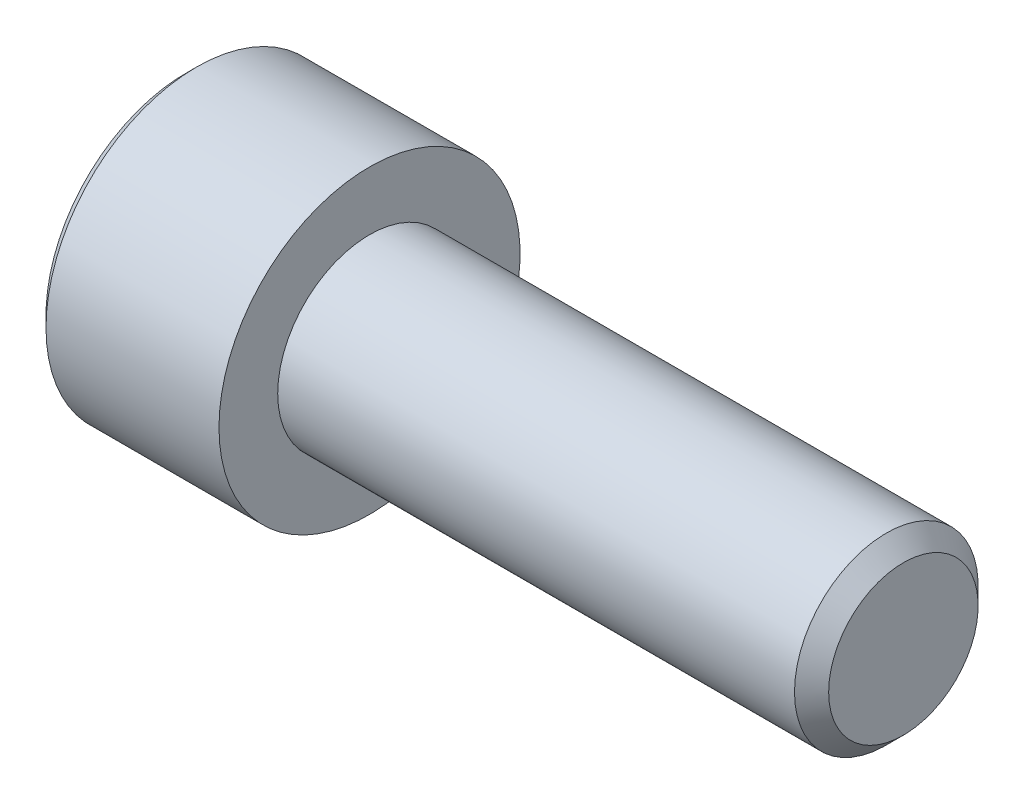
ISO-10303-21;
HEADER;
FILE_DESCRIPTION(('STEP AP214'),'2;1');
FILE_NAME('part.step','',(''),(''),'','','');
FILE_SCHEMA(('AUTOMOTIVE_DESIGN { 1 0 10303 214 1 1 1 1 }'));
ENDSEC;
DATA;
#1=APPLICATION_CONTEXT('core data for automotive mechanical design processes');
#2=APPLICATION_PROTOCOL_DEFINITION('international standard','automotive_design',2000,#1);
#3=PRODUCT_CONTEXT('',#1,'mechanical');
#4=PRODUCT('Part','Part','',(#3));
#5=PRODUCT_RELATED_PRODUCT_CATEGORY('part','',(#4));
#6=PRODUCT_DEFINITION_FORMATION('','',#4);
#7=PRODUCT_DEFINITION_CONTEXT('part definition',#1,'design');
#8=PRODUCT_DEFINITION('design','',#6,#7);
#9=PRODUCT_DEFINITION_SHAPE('','',#8);
#10=(LENGTH_UNIT() NAMED_UNIT(*) SI_UNIT(.MILLI.,.METRE.));
#11=(NAMED_UNIT(*) PLANE_ANGLE_UNIT() SI_UNIT($,.RADIAN.));
#12=(NAMED_UNIT(*) SI_UNIT($,.STERADIAN.) SOLID_ANGLE_UNIT());
#13=UNCERTAINTY_MEASURE_WITH_UNIT(LENGTH_MEASURE(1.E-05),#10,'distance_accuracy_value','');
#14=(GEOMETRIC_REPRESENTATION_CONTEXT(3) GLOBAL_UNCERTAINTY_ASSIGNED_CONTEXT((#13)) GLOBAL_UNIT_ASSIGNED_CONTEXT((#10,
#11,#12)) REPRESENTATION_CONTEXT('',''));
#15=CARTESIAN_POINT('',(0.,0.,0.));
#16=DIRECTION('',(0.,0.,1.));
#17=DIRECTION('',(1.,0.,0.));
#18=AXIS2_PLACEMENT_3D('',#15,#16,#17);
#19=CARTESIAN_POINT('',(-2.1844,0.,0.));
#20=DIRECTION('',(1.,0.,0.));
#21=DIRECTION('',(0.,0.,-1.));
#22=AXIS2_PLACEMENT_3D('',#19,#20,#21);
#23=PLANE('',#22);
#24=DIRECTION('',(0.,0.774957630261453,-0.632013189181645));
#25=VECTOR('',#24,1.);
#26=CARTESIAN_POINT('',(-2.1844,0.178167419232302,1.10018381375906));
#27=LINE('',#26,#25);
#28=CARTESIAN_POINT('',(-2.1844,0.178167419232302,1.10018381375906));
#29=VERTEX_POINT('',#28);
#30=CARTESIAN_POINT('',(-2.1844,1.04187084116395,0.395794395697646));
#31=VERTEX_POINT('',#30);
#32=EDGE_CURVE('E114',#29,#31,#27,.T.);
#33=ORIENTED_EDGE('',*,*,#32,.F.);
#34=DIRECTION('',(0.,0.934818292488851,0.355126400072184));
#35=VECTOR('',#34,1.);
#36=CARTESIAN_POINT('',(-2.1844,-0.863703421931645,0.704389418061416));
#37=LINE('',#36,#35);
#38=CARTESIAN_POINT('',(-2.1844,-0.863703421931645,0.704389418061416));
#39=VERTEX_POINT('',#38);
#40=EDGE_CURVE('E56',#39,#29,#37,.T.);
#41=ORIENTED_EDGE('',*,*,#40,.F.);
#42=DIRECTION('',(0.,0.159860662227399,0.987139589253829));
#43=VECTOR('',#42,1.);
#44=CARTESIAN_POINT('',(-2.1844,-1.04187084116395,-0.395794395697646));
#45=LINE('',#44,#43);
#46=CARTESIAN_POINT('',(-2.1844,-1.04187084116395,-0.395794395697646));
#47=VERTEX_POINT('',#46);
#48=EDGE_CURVE('E129',#47,#39,#45,.T.);
#49=ORIENTED_EDGE('',*,*,#48,.F.);
#50=DIRECTION('',(0.,-0.774957630261453,0.632013189181645));
#51=VECTOR('',#50,1.);
#52=CARTESIAN_POINT('',(-2.1844,-0.178167419232302,-1.10018381375906));
#53=LINE('',#52,#51);
#54=CARTESIAN_POINT('',(-2.1844,-0.178167419232302,-1.10018381375906));
#55=VERTEX_POINT('',#54);
#56=EDGE_CURVE('E123',#55,#47,#53,.T.);
#57=ORIENTED_EDGE('',*,*,#56,.F.);
#58=DIRECTION('',(0.,-0.934818292488851,-0.355126400072184));
#59=VECTOR('',#58,1.);
#60=CARTESIAN_POINT('',(-2.1844,0.863703421931645,-0.704389418061416));
#61=LINE('',#60,#59);
#62=CARTESIAN_POINT('',(-2.1844,0.863703421931645,-0.704389418061416));
#63=VERTEX_POINT('',#62);
#64=EDGE_CURVE('E121',#63,#55,#61,.T.);
#65=ORIENTED_EDGE('',*,*,#64,.F.);
#66=DIRECTION('',(0.,-0.159860662227399,-0.987139589253829));
#67=VECTOR('',#66,1.);
#68=CARTESIAN_POINT('',(-2.1844,1.04187084116395,0.395794395697646));
#69=LINE('',#68,#67);
#70=EDGE_CURVE('E107',#31,#63,#69,.T.);
#71=ORIENTED_EDGE('',*,*,#70,.F.);
#72=EDGE_LOOP('',(#33,#41,#49,#57,#65,#71));
#73=FACE_BOUND('',#72,.T.);
#74=CARTESIAN_POINT('',(-2.1844,0.,0.));
#75=DIRECTION('',(1.,0.,0.));
#76=DIRECTION('',(0.,0.,-1.));
#77=AXIS2_PLACEMENT_3D('',#74,#75,#76);
#78=CIRCLE('',#77,1.6637);
#79=CARTESIAN_POINT('',(-2.1844,0.,-1.6637));
#80=VERTEX_POINT('',#79);
#81=EDGE_CURVE('E49',#80,#80,#78,.F.);
#82=ORIENTED_EDGE('',*,*,#81,.T.);
#83=EDGE_LOOP('',(#82));
#84=FACE_BOUND('',#83,.T.);
#85=ADVANCED_FACE('F41',(#73,#84),#23,.F.);
#86=CARTESIAN_POINT('',(6.35,0.,0.));
#87=DIRECTION('',(-1.,0.,0.));
#88=DIRECTION('',(0.,0.,1.));
#89=AXIS2_PLACEMENT_3D('',#86,#87,#88);
#90=PLANE('',#89);
#91=CARTESIAN_POINT('',(6.35,0.,0.));
#92=DIRECTION('',(-1.,0.,0.));
#93=DIRECTION('',(0.,0.,1.));
#94=AXIS2_PLACEMENT_3D('',#91,#92,#93);
#95=CIRCLE('',#94,0.888999999999995);
#96=CARTESIAN_POINT('',(6.35,0.,0.888999999999995));
#97=VERTEX_POINT('',#96);
#98=EDGE_CURVE('E150',#97,#97,#95,.F.);
#99=ORIENTED_EDGE('',*,*,#98,.T.);
#100=EDGE_LOOP('',(#99));
#101=FACE_BOUND('',#100,.T.);
#102=ADVANCED_FACE('F170',(#101),#90,.F.);
#103=CARTESIAN_POINT('',(-2.1844,0.,0.));
#104=DIRECTION('',(-1.,0.,0.));
#105=DIRECTION('',(0.,0.,1.));
#106=AXIS2_PLACEMENT_3D('',#103,#104,#105);
#107=CYLINDRICAL_SURFACE('',#106,1.0922);
#108=CARTESIAN_POINT('',(6.1468,0.,0.));
#109=DIRECTION('',(-1.,0.,0.));
#110=DIRECTION('',(0.,0.,1.));
#111=AXIS2_PLACEMENT_3D('',#108,#109,#110);
#112=CIRCLE('',#111,1.0922);
#113=CARTESIAN_POINT('',(6.1468,0.,1.0922));
#114=VERTEX_POINT('',#113);
#115=EDGE_CURVE('E147',#114,#114,#112,.T.);
#116=ORIENTED_EDGE('',*,*,#115,.T.);
#117=EDGE_LOOP('',(#116));
#118=FACE_BOUND('',#117,.T.);
#119=CARTESIAN_POINT('',(0.,0.,0.));
#120=DIRECTION('',(-1.,0.,0.));
#121=DIRECTION('',(0.,0.,1.));
#122=AXIS2_PLACEMENT_3D('',#119,#120,#121);
#123=CIRCLE('',#122,1.0922);
#124=CARTESIAN_POINT('',(0.,0.,1.0922));
#125=VERTEX_POINT('',#124);
#126=EDGE_CURVE('E144',#125,#125,#123,.T.);
#127=ORIENTED_EDGE('',*,*,#126,.F.);
#128=EDGE_LOOP('',(#127));
#129=FACE_BOUND('',#128,.T.);
#130=ADVANCED_FACE('F175',(#118,#129),#107,.T.);
#131=CARTESIAN_POINT('',(0.,1.0922,0.));
#132=DIRECTION('',(-1.,0.,0.));
#133=DIRECTION('',(0.,0.,1.));
#134=AXIS2_PLACEMENT_3D('',#131,#132,#133);
#135=PLANE('',#134);
#136=CARTESIAN_POINT('',(0.,0.,0.));
#137=DIRECTION('',(-1.,0.,0.));
#138=DIRECTION('',(0.,0.,1.));
#139=AXIS2_PLACEMENT_3D('',#136,#137,#138);
#140=CIRCLE('',#139,1.7907);
#141=CARTESIAN_POINT('',(0.,0.,1.7907));
#142=VERTEX_POINT('',#141);
#143=EDGE_CURVE('E141',#142,#142,#140,.T.);
#144=ORIENTED_EDGE('',*,*,#143,.F.);
#145=EDGE_LOOP('',(#144));
#146=FACE_BOUND('',#145,.T.);
#147=ORIENTED_EDGE('',*,*,#126,.T.);
#148=EDGE_LOOP('',(#147));
#149=FACE_BOUND('',#148,.T.);
#150=ADVANCED_FACE('F181',(#146,#149),#135,.F.);
#151=CARTESIAN_POINT('',(-2.1844,0.,0.));
#152=DIRECTION('',(-1.,0.,0.));
#153=DIRECTION('',(0.,0.,1.));
#154=AXIS2_PLACEMENT_3D('',#151,#152,#153);
#155=CYLINDRICAL_SURFACE('',#154,1.7907);
#156=CARTESIAN_POINT('',(-2.0574,0.,0.));
#157=DIRECTION('',(1.,0.,0.));
#158=DIRECTION('',(0.,0.,-1.));
#159=AXIS2_PLACEMENT_3D('',#156,#157,#158);
#160=CIRCLE('',#159,1.7907);
#161=CARTESIAN_POINT('',(-2.0574,0.,-1.7907));
#162=VERTEX_POINT('',#161);
#163=EDGE_CURVE('E12',#162,#162,#160,.T.);
#164=ORIENTED_EDGE('',*,*,#163,.T.);
#165=EDGE_LOOP('',(#164));
#166=FACE_BOUND('',#165,.T.);
#167=ORIENTED_EDGE('',*,*,#143,.T.);
#168=EDGE_LOOP('',(#167));
#169=FACE_BOUND('',#168,.T.);
#170=ADVANCED_FACE('F167',(#166,#169),#155,.T.);
#171=CARTESIAN_POINT('',(6.1468,0.,0.));
#172=DIRECTION('',(-1.,0.,0.));
#173=DIRECTION('',(0.,0.,1.));
#174=AXIS2_PLACEMENT_3D('',#171,#172,#173);
#175=CONICAL_SURFACE('',#174,1.0922,0.785398163397456);
#176=ORIENTED_EDGE('',*,*,#98,.F.);
#177=EDGE_LOOP('',(#176));
#178=FACE_BOUND('',#177,.T.);
#179=ORIENTED_EDGE('',*,*,#115,.F.);
#180=EDGE_LOOP('',(#179));
#181=FACE_BOUND('',#180,.T.);
#182=ADVANCED_FACE('F157',(#178,#181),#175,.T.);
#183=CARTESIAN_POINT('',(-2.1844,0.,0.));
#184=DIRECTION('',(1.,0.,0.));
#185=DIRECTION('',(0.,0.,-1.));
#186=AXIS2_PLACEMENT_3D('',#183,#184,#185);
#187=CONICAL_SURFACE('',#186,1.6637,0.785398163397443);
#188=ORIENTED_EDGE('',*,*,#163,.F.);
#189=EDGE_LOOP('',(#188));
#190=FACE_BOUND('',#189,.T.);
#191=ORIENTED_EDGE('',*,*,#81,.F.);
#192=EDGE_LOOP('',(#191));
#193=FACE_BOUND('',#192,.T.);
#194=ADVANCED_FACE('F43',(#190,#193),#187,.T.);
#195=CARTESIAN_POINT('',(3.03044503248292,-0.863703421931645,0.704389418061416));
#196=DIRECTION('',(0.,-0.355126400072184,0.934818292488851));
#197=DIRECTION('',(0.,-0.934818292488851,-0.355126400072184));
#198=AXIS2_PLACEMENT_3D('',#195,#196,#197);
#199=PLANE('',#198);
#200=DIRECTION('',(0.,-0.934818292488851,-0.355126400072184));
#201=VECTOR('',#200,1.);
#202=CARTESIAN_POINT('',(-0.635,-0.863703421931645,0.704389418061416));
#203=LINE('',#202,#201);
#204=CARTESIAN_POINT('',(-0.635,0.178167419232302,1.10018381375906));
#205=VERTEX_POINT('',#204);
#206=CARTESIAN_POINT('',(-0.635,-0.863703421931645,0.704389418061416));
#207=VERTEX_POINT('',#206);
#208=EDGE_CURVE('E75',#205,#207,#203,.T.);
#209=ORIENTED_EDGE('',*,*,#208,.T.);
#210=DIRECTION('',(-1.,0.,0.));
#211=VECTOR('',#210,1.);
#212=CARTESIAN_POINT('',(3.03044503248292,-0.863703421931645,0.704389418061416));
#213=LINE('',#212,#211);
#214=EDGE_CURVE('E132',#207,#39,#213,.T.);
#215=ORIENTED_EDGE('',*,*,#214,.T.);
#216=ORIENTED_EDGE('',*,*,#40,.T.);
#217=DIRECTION('',(-1.,0.,0.));
#218=VECTOR('',#217,1.);
#219=CARTESIAN_POINT('',(3.03044503248292,0.178167419232302,1.10018381375906));
#220=LINE('',#219,#218);
#221=EDGE_CURVE('E111',#205,#29,#220,.T.);
#222=ORIENTED_EDGE('',*,*,#221,.F.);
#223=EDGE_LOOP('',(#209,#215,#216,#222));
#224=FACE_BOUND('',#223,.T.);
#225=ADVANCED_FACE('F156',(#224),#199,.F.);
#226=CARTESIAN_POINT('',(3.03044503248292,-1.04187084116395,-0.395794395697646));
#227=DIRECTION('',(0.,-0.987139589253829,0.159860662227399));
#228=DIRECTION('',(0.,-0.159860662227399,-0.987139589253829));
#229=AXIS2_PLACEMENT_3D('',#226,#227,#228);
#230=PLANE('',#229);
#231=DIRECTION('',(0.,-0.159860662227399,-0.987139589253829));
#232=VECTOR('',#231,1.);
#233=CARTESIAN_POINT('',(-0.635,-1.04187084116395,-0.395794395697646));
#234=LINE('',#233,#232);
#235=CARTESIAN_POINT('',(-0.635,-1.04187084116395,-0.395794395697646));
#236=VERTEX_POINT('',#235);
#237=EDGE_CURVE('E208',#207,#236,#234,.T.);
#238=ORIENTED_EDGE('',*,*,#237,.T.);
#239=DIRECTION('',(-1.,0.,0.));
#240=VECTOR('',#239,1.);
#241=CARTESIAN_POINT('',(3.03044503248292,-1.04187084116395,-0.395794395697646));
#242=LINE('',#241,#240);
#243=EDGE_CURVE('E134',#236,#47,#242,.T.);
#244=ORIENTED_EDGE('',*,*,#243,.T.);
#245=ORIENTED_EDGE('',*,*,#48,.T.);
#246=ORIENTED_EDGE('',*,*,#214,.F.);
#247=EDGE_LOOP('',(#238,#244,#245,#246));
#248=FACE_BOUND('',#247,.T.);
#249=ADVANCED_FACE('F164',(#248),#230,.F.);
#250=CARTESIAN_POINT('',(3.03044503248292,-0.178167419232302,-1.10018381375906));
#251=DIRECTION('',(0.,-0.632013189181645,-0.774957630261453));
#252=DIRECTION('',(0.,0.774957630261453,-0.632013189181645));
#253=AXIS2_PLACEMENT_3D('',#250,#251,#252);
#254=PLANE('',#253);
#255=DIRECTION('',(0.,0.774957630261453,-0.632013189181645));
#256=VECTOR('',#255,1.);
#257=CARTESIAN_POINT('',(-0.635,-0.178167419232302,-1.10018381375906));
#258=LINE('',#257,#256);
#259=CARTESIAN_POINT('',(-0.635,-0.178167419232302,-1.10018381375906));
#260=VERTEX_POINT('',#259);
#261=EDGE_CURVE('E211',#236,#260,#258,.T.);
#262=ORIENTED_EDGE('',*,*,#261,.T.);
#263=DIRECTION('',(-1.,0.,0.));
#264=VECTOR('',#263,1.);
#265=CARTESIAN_POINT('',(3.03044503248292,-0.178167419232302,-1.10018381375906));
#266=LINE('',#265,#264);
#267=EDGE_CURVE('E136',#260,#55,#266,.T.);
#268=ORIENTED_EDGE('',*,*,#267,.T.);
#269=ORIENTED_EDGE('',*,*,#56,.T.);
#270=ORIENTED_EDGE('',*,*,#243,.F.);
#271=EDGE_LOOP('',(#262,#268,#269,#270));
#272=FACE_BOUND('',#271,.T.);
#273=ADVANCED_FACE('F196',(#272),#254,.F.);
#274=CARTESIAN_POINT('',(3.03044503248292,0.863703421931645,-0.704389418061416));
#275=DIRECTION('',(0.,0.355126400072184,-0.934818292488851));
#276=DIRECTION('',(0.,0.934818292488851,0.355126400072184));
#277=AXIS2_PLACEMENT_3D('',#274,#275,#276);
#278=PLANE('',#277);
#279=DIRECTION('',(0.,0.934818292488851,0.355126400072184));
#280=VECTOR('',#279,1.);
#281=CARTESIAN_POINT('',(-0.635,0.863703421931645,-0.704389418061416));
#282=LINE('',#281,#280);
#283=CARTESIAN_POINT('',(-0.635,0.863703421931645,-0.704389418061416));
#284=VERTEX_POINT('',#283);
#285=EDGE_CURVE('E65',#260,#284,#282,.T.);
#286=ORIENTED_EDGE('',*,*,#285,.T.);
#287=DIRECTION('',(-1.,0.,0.));
#288=VECTOR('',#287,1.);
#289=CARTESIAN_POINT('',(3.03044503248292,0.863703421931645,-0.704389418061416));
#290=LINE('',#289,#288);
#291=EDGE_CURVE('E110',#284,#63,#290,.T.);
#292=ORIENTED_EDGE('',*,*,#291,.T.);
#293=ORIENTED_EDGE('',*,*,#64,.T.);
#294=ORIENTED_EDGE('',*,*,#267,.F.);
#295=EDGE_LOOP('',(#286,#292,#293,#294));
#296=FACE_BOUND('',#295,.T.);
#297=ADVANCED_FACE('F193',(#296),#278,.F.);
#298=CARTESIAN_POINT('',(3.03044503248292,1.04187084116395,0.395794395697646));
#299=DIRECTION('',(0.,0.987139589253829,-0.159860662227399));
#300=DIRECTION('',(0.,0.159860662227399,0.987139589253829));
#301=AXIS2_PLACEMENT_3D('',#298,#299,#300);
#302=PLANE('',#301);
#303=DIRECTION('',(0.,0.159860662227399,0.987139589253829));
#304=VECTOR('',#303,1.);
#305=CARTESIAN_POINT('',(-0.635,1.04187084116395,0.395794395697646));
#306=LINE('',#305,#304);
#307=CARTESIAN_POINT('',(-0.634999999999999,1.04187084116395,0.395794395697646));
#308=VERTEX_POINT('',#307);
#309=EDGE_CURVE('E109',#284,#308,#306,.T.);
#310=ORIENTED_EDGE('',*,*,#309,.T.);
#311=DIRECTION('',(-1.,0.,0.));
#312=VECTOR('',#311,1.);
#313=CARTESIAN_POINT('',(3.03044503248292,1.04187084116395,0.395794395697646));
#314=LINE('',#313,#312);
#315=EDGE_CURVE('E102',#308,#31,#314,.T.);
#316=ORIENTED_EDGE('',*,*,#315,.T.);
#317=ORIENTED_EDGE('',*,*,#70,.T.);
#318=ORIENTED_EDGE('',*,*,#291,.F.);
#319=EDGE_LOOP('',(#310,#316,#317,#318));
#320=FACE_BOUND('',#319,.T.);
#321=ADVANCED_FACE('F104',(#320),#302,.F.);
#322=CARTESIAN_POINT('',(3.03044503248292,0.178167419232302,1.10018381375906));
#323=DIRECTION('',(0.,0.632013189181645,0.774957630261452));
#324=DIRECTION('',(0.,-0.774957630261452,0.632013189181645));
#325=AXIS2_PLACEMENT_3D('',#322,#323,#324);
#326=PLANE('',#325);
#327=DIRECTION('',(0.,-0.774957630261452,0.632013189181645));
#328=VECTOR('',#327,1.);
#329=CARTESIAN_POINT('',(-0.635,0.178167419232302,1.10018381375906));
#330=LINE('',#329,#328);
#331=EDGE_CURVE('E84',#308,#205,#330,.T.);
#332=ORIENTED_EDGE('',*,*,#331,.T.);
#333=ORIENTED_EDGE('',*,*,#221,.T.);
#334=ORIENTED_EDGE('',*,*,#32,.T.);
#335=ORIENTED_EDGE('',*,*,#315,.F.);
#336=EDGE_LOOP('',(#332,#333,#334,#335));
#337=FACE_BOUND('',#336,.T.);
#338=ADVANCED_FACE('F115',(#337),#326,.F.);
#339=CARTESIAN_POINT('',(-0.635,1.0922,0.));
#340=DIRECTION('',(-1.,0.,0.));
#341=DIRECTION('',(0.,0.,1.));
#342=AXIS2_PLACEMENT_3D('',#339,#340,#341);
#343=PLANE('',#342);
#344=ORIENTED_EDGE('',*,*,#208,.F.);
#345=ORIENTED_EDGE('',*,*,#331,.F.);
#346=ORIENTED_EDGE('',*,*,#309,.F.);
#347=ORIENTED_EDGE('',*,*,#285,.F.);
#348=ORIENTED_EDGE('',*,*,#261,.F.);
#349=ORIENTED_EDGE('',*,*,#237,.F.);
#350=EDGE_LOOP('',(#344,#345,#346,#347,#348,#349));
#351=FACE_BOUND('',#350,.T.);
#352=ADVANCED_FACE('F190',(#351),#343,.T.);
#353=CLOSED_SHELL('',(#85,#102,#130,#150,#170,#182,#194,#225,#249,#273,#297,#321,#338,#352));
#354=MANIFOLD_SOLID_BREP('B2',#353);
#355=ADVANCED_BREP_SHAPE_REPRESENTATION('',(#18,#354),#14);
#356=SHAPE_DEFINITION_REPRESENTATION(#9,#355);
ENDSEC;
END-ISO-10303-21;
